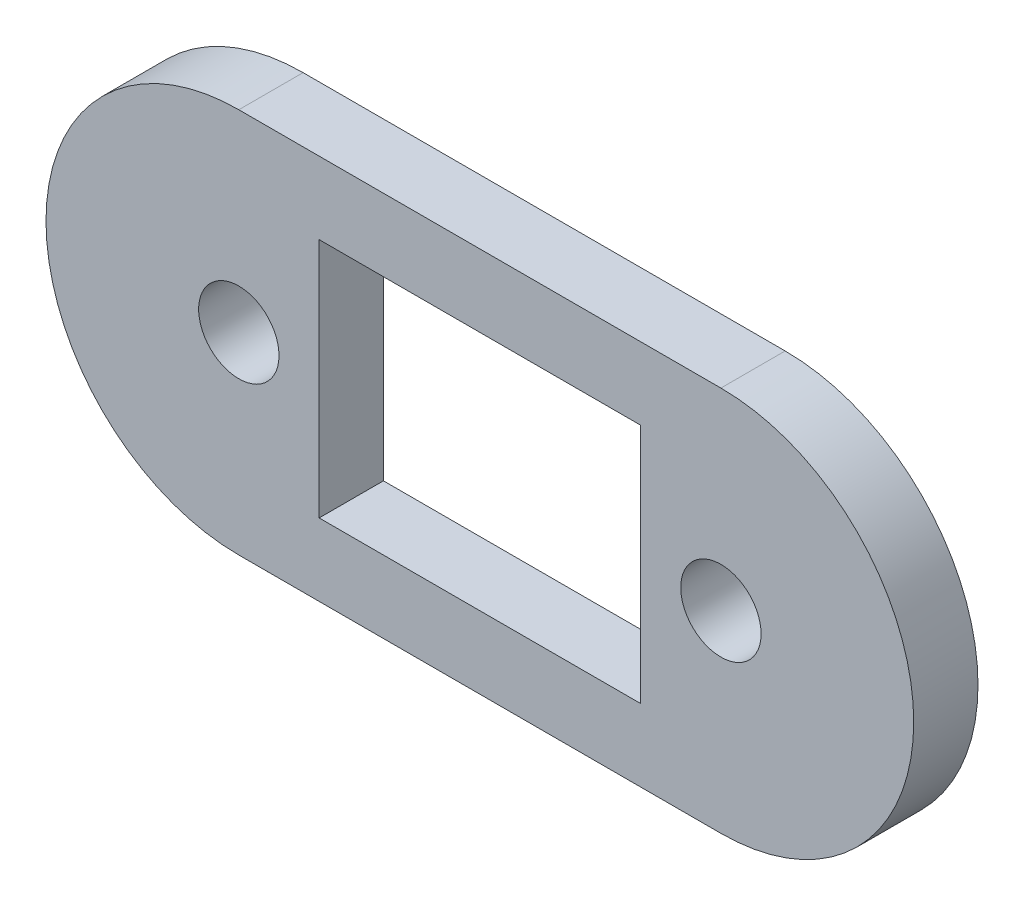
ISO-10303-21;
HEADER;
FILE_DESCRIPTION(('STEP AP214'),'2;1');
FILE_NAME('part.step','',(''),(''),'','','');
FILE_SCHEMA(('AUTOMOTIVE_DESIGN { 1 0 10303 214 1 1 1 1 }'));
ENDSEC;
DATA;
#1=APPLICATION_CONTEXT('core data for automotive mechanical design processes');
#2=APPLICATION_PROTOCOL_DEFINITION('international standard','automotive_design',2000,#1);
#3=PRODUCT_CONTEXT('',#1,'mechanical');
#4=PRODUCT('Part','Part','',(#3));
#5=PRODUCT_RELATED_PRODUCT_CATEGORY('part','',(#4));
#6=PRODUCT_DEFINITION_FORMATION('','',#4);
#7=PRODUCT_DEFINITION_CONTEXT('part definition',#1,'design');
#8=PRODUCT_DEFINITION('design','',#6,#7);
#9=PRODUCT_DEFINITION_SHAPE('','',#8);
#10=(LENGTH_UNIT() NAMED_UNIT(*) SI_UNIT(.MILLI.,.METRE.));
#11=(NAMED_UNIT(*) PLANE_ANGLE_UNIT() SI_UNIT($,.RADIAN.));
#12=(NAMED_UNIT(*) SI_UNIT($,.STERADIAN.) SOLID_ANGLE_UNIT());
#13=UNCERTAINTY_MEASURE_WITH_UNIT(LENGTH_MEASURE(1.E-05),#10,'distance_accuracy_value','');
#14=(GEOMETRIC_REPRESENTATION_CONTEXT(3) GLOBAL_UNCERTAINTY_ASSIGNED_CONTEXT((#13)) GLOBAL_UNIT_ASSIGNED_CONTEXT((#10,
#11,#12)) REPRESENTATION_CONTEXT('',''));
#15=CARTESIAN_POINT('',(0.,0.,0.));
#16=DIRECTION('',(0.,0.,1.));
#17=DIRECTION('',(1.,0.,0.));
#18=AXIS2_PLACEMENT_3D('',#15,#16,#17);
#19=CARTESIAN_POINT('',(-75.,0.,20.));
#20=DIRECTION('',(0.,0.,1.));
#21=DIRECTION('',(1.,0.,0.));
#22=AXIS2_PLACEMENT_3D('',#19,#20,#21);
#23=PLANE('',#22);
#24=CARTESIAN_POINT('',(75.,0.,20.));
#25=DIRECTION('',(0.,0.,1.));
#26=DIRECTION('',(1.,0.,0.));
#27=AXIS2_PLACEMENT_3D('',#24,#25,#26);
#28=CIRCLE('',#27,12.5);
#29=CARTESIAN_POINT('',(87.5,0.,20.));
#30=VERTEX_POINT('',#29);
#31=EDGE_CURVE('E126',#30,#30,#28,.T.);
#32=ORIENTED_EDGE('',*,*,#31,.F.);
#33=EDGE_LOOP('',(#32));
#34=FACE_BOUND('',#33,.T.);
#35=CARTESIAN_POINT('',(-75.,0.,20.));
#36=DIRECTION('',(0.,0.,1.));
#37=DIRECTION('',(1.,0.,0.));
#38=AXIS2_PLACEMENT_3D('',#35,#36,#37);
#39=CIRCLE('',#38,60.);
#40=CARTESIAN_POINT('',(-75.,60.,20.));
#41=VERTEX_POINT('',#40);
#42=CARTESIAN_POINT('',(-75.,-60.,20.));
#43=VERTEX_POINT('',#42);
#44=EDGE_CURVE('E136',#41,#43,#39,.T.);
#45=ORIENTED_EDGE('',*,*,#44,.T.);
#46=DIRECTION('',(1.,0.,0.));
#47=VECTOR('',#46,1.);
#48=CARTESIAN_POINT('',(-75.,-60.,20.));
#49=LINE('',#48,#47);
#50=CARTESIAN_POINT('',(75.,-60.,20.));
#51=VERTEX_POINT('',#50);
#52=EDGE_CURVE('E139',#43,#51,#49,.T.);
#53=ORIENTED_EDGE('',*,*,#52,.T.);
#54=CARTESIAN_POINT('',(75.,0.,20.));
#55=DIRECTION('',(0.,0.,1.));
#56=DIRECTION('',(1.,0.,0.));
#57=AXIS2_PLACEMENT_3D('',#54,#55,#56);
#58=CIRCLE('',#57,60.);
#59=CARTESIAN_POINT('',(75.,60.,20.));
#60=VERTEX_POINT('',#59);
#61=EDGE_CURVE('E142',#51,#60,#58,.T.);
#62=ORIENTED_EDGE('',*,*,#61,.T.);
#63=DIRECTION('',(-1.,0.,0.));
#64=VECTOR('',#63,1.);
#65=CARTESIAN_POINT('',(-75.,60.,20.));
#66=LINE('',#65,#64);
#67=EDGE_CURVE('E144',#60,#41,#66,.T.);
#68=ORIENTED_EDGE('',*,*,#67,.T.);
#69=EDGE_LOOP('',(#45,#53,#62,#68));
#70=FACE_BOUND('',#69,.T.);
#71=DIRECTION('',(1.,0.,0.));
#72=VECTOR('',#71,1.);
#73=CARTESIAN_POINT('',(50.,-37.5,20.));
#74=LINE('',#73,#72);
#75=CARTESIAN_POINT('',(-50.,-37.5,20.));
#76=VERTEX_POINT('',#75);
#77=CARTESIAN_POINT('',(50.,-37.5,20.));
#78=VERTEX_POINT('',#77);
#79=EDGE_CURVE('E105',#76,#78,#74,.T.);
#80=ORIENTED_EDGE('',*,*,#79,.F.);
#81=DIRECTION('',(0.,-1.,0.));
#82=VECTOR('',#81,1.);
#83=CARTESIAN_POINT('',(-50.,-37.5,20.));
#84=LINE('',#83,#82);
#85=CARTESIAN_POINT('',(-50.,37.5,20.));
#86=VERTEX_POINT('',#85);
#87=EDGE_CURVE('E97',#86,#76,#84,.T.);
#88=ORIENTED_EDGE('',*,*,#87,.F.);
#89=DIRECTION('',(-1.,0.,0.));
#90=VECTOR('',#89,1.);
#91=CARTESIAN_POINT('',(50.,37.5,20.));
#92=LINE('',#91,#90);
#93=CARTESIAN_POINT('',(50.,37.5,20.));
#94=VERTEX_POINT('',#93);
#95=EDGE_CURVE('E120',#94,#86,#92,.T.);
#96=ORIENTED_EDGE('',*,*,#95,.F.);
#97=DIRECTION('',(0.,1.,0.));
#98=VECTOR('',#97,1.);
#99=CARTESIAN_POINT('',(50.,-37.5,20.));
#100=LINE('',#99,#98);
#101=EDGE_CURVE('E118',#78,#94,#100,.T.);
#102=ORIENTED_EDGE('',*,*,#101,.F.);
#103=EDGE_LOOP('',(#80,#88,#96,#102));
#104=FACE_BOUND('',#103,.T.);
#105=CARTESIAN_POINT('',(-75.,0.,20.));
#106=DIRECTION('',(0.,0.,1.));
#107=DIRECTION('',(1.,0.,0.));
#108=AXIS2_PLACEMENT_3D('',#105,#106,#107);
#109=CIRCLE('',#108,12.5);
#110=CARTESIAN_POINT('',(-62.5,0.,20.));
#111=VERTEX_POINT('',#110);
#112=EDGE_CURVE('E226',#111,#111,#109,.T.);
#113=ORIENTED_EDGE('',*,*,#112,.F.);
#114=EDGE_LOOP('',(#113));
#115=FACE_BOUND('',#114,.T.);
#116=ADVANCED_FACE('F32',(#34,#70,#104,#115),#23,.T.);
#117=CARTESIAN_POINT('',(-75.,0.,0.));
#118=DIRECTION('',(0.,0.,1.));
#119=DIRECTION('',(1.,0.,0.));
#120=AXIS2_PLACEMENT_3D('',#117,#118,#119);
#121=PLANE('',#120);
#122=CARTESIAN_POINT('',(-75.,0.,0.));
#123=DIRECTION('',(0.,0.,1.));
#124=DIRECTION('',(1.,0.,0.));
#125=AXIS2_PLACEMENT_3D('',#122,#123,#124);
#126=CIRCLE('',#125,60.);
#127=CARTESIAN_POINT('',(-75.,60.,0.));
#128=VERTEX_POINT('',#127);
#129=CARTESIAN_POINT('',(-75.,-60.,0.));
#130=VERTEX_POINT('',#129);
#131=EDGE_CURVE('E113',#128,#130,#126,.T.);
#132=ORIENTED_EDGE('',*,*,#131,.F.);
#133=DIRECTION('',(-1.,0.,0.));
#134=VECTOR('',#133,1.);
#135=CARTESIAN_POINT('',(-75.,60.,0.));
#136=LINE('',#135,#134);
#137=CARTESIAN_POINT('',(75.,60.,0.));
#138=VERTEX_POINT('',#137);
#139=EDGE_CURVE('E140',#138,#128,#136,.T.);
#140=ORIENTED_EDGE('',*,*,#139,.F.);
#141=CARTESIAN_POINT('',(75.,0.,0.));
#142=DIRECTION('',(0.,0.,1.));
#143=DIRECTION('',(1.,0.,0.));
#144=AXIS2_PLACEMENT_3D('',#141,#142,#143);
#145=CIRCLE('',#144,60.);
#146=CARTESIAN_POINT('',(75.,-60.,0.));
#147=VERTEX_POINT('',#146);
#148=EDGE_CURVE('E151',#147,#138,#145,.T.);
#149=ORIENTED_EDGE('',*,*,#148,.F.);
#150=DIRECTION('',(1.,0.,0.));
#151=VECTOR('',#150,1.);
#152=CARTESIAN_POINT('',(-75.,-60.,0.));
#153=LINE('',#152,#151);
#154=EDGE_CURVE('E149',#130,#147,#153,.T.);
#155=ORIENTED_EDGE('',*,*,#154,.F.);
#156=EDGE_LOOP('',(#132,#140,#149,#155));
#157=FACE_BOUND('',#156,.T.);
#158=DIRECTION('',(0.,-1.,0.));
#159=VECTOR('',#158,1.);
#160=CARTESIAN_POINT('',(-50.,-37.5,0.));
#161=LINE('',#160,#159);
#162=CARTESIAN_POINT('',(-50.,37.5,0.));
#163=VERTEX_POINT('',#162);
#164=CARTESIAN_POINT('',(-50.,-37.5,0.));
#165=VERTEX_POINT('',#164);
#166=EDGE_CURVE('E55',#163,#165,#161,.T.);
#167=ORIENTED_EDGE('',*,*,#166,.T.);
#168=DIRECTION('',(1.,0.,0.));
#169=VECTOR('',#168,1.);
#170=CARTESIAN_POINT('',(50.,-37.5,0.));
#171=LINE('',#170,#169);
#172=CARTESIAN_POINT('',(50.,-37.5,0.));
#173=VERTEX_POINT('',#172);
#174=EDGE_CURVE('E112',#165,#173,#171,.T.);
#175=ORIENTED_EDGE('',*,*,#174,.T.);
#176=DIRECTION('',(0.,1.,0.));
#177=VECTOR('',#176,1.);
#178=CARTESIAN_POINT('',(50.,-37.5,0.));
#179=LINE('',#178,#177);
#180=CARTESIAN_POINT('',(50.,37.5,0.));
#181=VERTEX_POINT('',#180);
#182=EDGE_CURVE('E128',#173,#181,#179,.T.);
#183=ORIENTED_EDGE('',*,*,#182,.T.);
#184=DIRECTION('',(-1.,0.,0.));
#185=VECTOR('',#184,1.);
#186=CARTESIAN_POINT('',(50.,37.5,0.));
#187=LINE('',#186,#185);
#188=EDGE_CURVE('E106',#181,#163,#187,.T.);
#189=ORIENTED_EDGE('',*,*,#188,.T.);
#190=EDGE_LOOP('',(#167,#175,#183,#189));
#191=FACE_BOUND('',#190,.T.);
#192=CARTESIAN_POINT('',(75.,0.,0.));
#193=DIRECTION('',(0.,0.,1.));
#194=DIRECTION('',(1.,0.,0.));
#195=AXIS2_PLACEMENT_3D('',#192,#193,#194);
#196=CIRCLE('',#195,12.5);
#197=CARTESIAN_POINT('',(87.5,0.,0.));
#198=VERTEX_POINT('',#197);
#199=EDGE_CURVE('E232',#198,#198,#196,.T.);
#200=ORIENTED_EDGE('',*,*,#199,.T.);
#201=EDGE_LOOP('',(#200));
#202=FACE_BOUND('',#201,.T.);
#203=CARTESIAN_POINT('',(-75.,0.,0.));
#204=DIRECTION('',(0.,0.,1.));
#205=DIRECTION('',(1.,0.,0.));
#206=AXIS2_PLACEMENT_3D('',#203,#204,#205);
#207=CIRCLE('',#206,12.5);
#208=CARTESIAN_POINT('',(-62.5,0.,0.));
#209=VERTEX_POINT('',#208);
#210=EDGE_CURVE('E229',#209,#209,#207,.T.);
#211=ORIENTED_EDGE('',*,*,#210,.T.);
#212=EDGE_LOOP('',(#211));
#213=FACE_BOUND('',#212,.T.);
#214=ADVANCED_FACE('F169',(#157,#191,#202,#213),#121,.F.);
#215=CARTESIAN_POINT('',(-75.,0.,20.));
#216=DIRECTION('',(0.,0.,-1.));
#217=DIRECTION('',(-1.,0.,0.));
#218=AXIS2_PLACEMENT_3D('',#215,#216,#217);
#219=CYLINDRICAL_SURFACE('',#218,60.);
#220=ORIENTED_EDGE('',*,*,#131,.T.);
#221=DIRECTION('',(0.,0.,-1.));
#222=VECTOR('',#221,1.);
#223=CARTESIAN_POINT('',(-75.,-60.,20.));
#224=LINE('',#223,#222);
#225=EDGE_CURVE('E11',#43,#130,#224,.T.);
#226=ORIENTED_EDGE('',*,*,#225,.F.);
#227=ORIENTED_EDGE('',*,*,#44,.F.);
#228=DIRECTION('',(0.,0.,-1.));
#229=VECTOR('',#228,1.);
#230=CARTESIAN_POINT('',(-75.,60.,20.));
#231=LINE('',#230,#229);
#232=EDGE_CURVE('E146',#41,#128,#231,.T.);
#233=ORIENTED_EDGE('',*,*,#232,.T.);
#234=EDGE_LOOP('',(#220,#226,#227,#233));
#235=FACE_BOUND('',#234,.T.);
#236=ADVANCED_FACE('F34',(#235),#219,.T.);
#237=CARTESIAN_POINT('',(-75.,-60.,20.));
#238=DIRECTION('',(0.,1.,0.));
#239=DIRECTION('',(-1.,0.,0.));
#240=AXIS2_PLACEMENT_3D('',#237,#238,#239);
#241=PLANE('',#240);
#242=ORIENTED_EDGE('',*,*,#154,.T.);
#243=DIRECTION('',(0.,0.,-1.));
#244=VECTOR('',#243,1.);
#245=CARTESIAN_POINT('',(75.,-60.,20.));
#246=LINE('',#245,#244);
#247=EDGE_CURVE('E40',#51,#147,#246,.T.);
#248=ORIENTED_EDGE('',*,*,#247,.F.);
#249=ORIENTED_EDGE('',*,*,#52,.F.);
#250=ORIENTED_EDGE('',*,*,#225,.T.);
#251=EDGE_LOOP('',(#242,#248,#249,#250));
#252=FACE_BOUND('',#251,.T.);
#253=ADVANCED_FACE('F179',(#252),#241,.F.);
#254=CARTESIAN_POINT('',(75.,0.,20.));
#255=DIRECTION('',(0.,0.,-1.));
#256=DIRECTION('',(-1.,0.,0.));
#257=AXIS2_PLACEMENT_3D('',#254,#255,#256);
#258=CYLINDRICAL_SURFACE('',#257,60.);
#259=ORIENTED_EDGE('',*,*,#148,.T.);
#260=DIRECTION('',(0.,0.,-1.));
#261=VECTOR('',#260,1.);
#262=CARTESIAN_POINT('',(75.,60.,20.));
#263=LINE('',#262,#261);
#264=EDGE_CURVE('E156',#60,#138,#263,.T.);
#265=ORIENTED_EDGE('',*,*,#264,.F.);
#266=ORIENTED_EDGE('',*,*,#61,.F.);
#267=ORIENTED_EDGE('',*,*,#247,.T.);
#268=EDGE_LOOP('',(#259,#265,#266,#267));
#269=FACE_BOUND('',#268,.T.);
#270=ADVANCED_FACE('F163',(#269),#258,.T.);
#271=CARTESIAN_POINT('',(-75.,60.,20.));
#272=DIRECTION('',(0.,-1.,0.));
#273=DIRECTION('',(1.,0.,0.));
#274=AXIS2_PLACEMENT_3D('',#271,#272,#273);
#275=PLANE('',#274);
#276=ORIENTED_EDGE('',*,*,#139,.T.);
#277=ORIENTED_EDGE('',*,*,#232,.F.);
#278=ORIENTED_EDGE('',*,*,#67,.F.);
#279=ORIENTED_EDGE('',*,*,#264,.T.);
#280=EDGE_LOOP('',(#276,#277,#278,#279));
#281=FACE_BOUND('',#280,.T.);
#282=ADVANCED_FACE('F173',(#281),#275,.F.);
#283=CARTESIAN_POINT('',(-50.,-37.5,20.));
#284=DIRECTION('',(1.,0.,0.));
#285=DIRECTION('',(0.,1.,0.));
#286=AXIS2_PLACEMENT_3D('',#283,#284,#285);
#287=PLANE('',#286);
#288=ORIENTED_EDGE('',*,*,#166,.F.);
#289=DIRECTION('',(0.,0.,-1.));
#290=VECTOR('',#289,1.);
#291=CARTESIAN_POINT('',(-50.,37.5,20.));
#292=LINE('',#291,#290);
#293=EDGE_CURVE('E101',#86,#163,#292,.T.);
#294=ORIENTED_EDGE('',*,*,#293,.F.);
#295=ORIENTED_EDGE('',*,*,#87,.T.);
#296=DIRECTION('',(0.,0.,-1.));
#297=VECTOR('',#296,1.);
#298=CARTESIAN_POINT('',(-50.,-37.5,20.));
#299=LINE('',#298,#297);
#300=EDGE_CURVE('E100',#76,#165,#299,.T.);
#301=ORIENTED_EDGE('',*,*,#300,.T.);
#302=EDGE_LOOP('',(#288,#294,#295,#301));
#303=FACE_BOUND('',#302,.T.);
#304=ADVANCED_FACE('F99',(#303),#287,.T.);
#305=CARTESIAN_POINT('',(50.,-37.5,20.));
#306=DIRECTION('',(0.,1.,0.));
#307=DIRECTION('',(-1.,0.,0.));
#308=AXIS2_PLACEMENT_3D('',#305,#306,#307);
#309=PLANE('',#308);
#310=ORIENTED_EDGE('',*,*,#174,.F.);
#311=ORIENTED_EDGE('',*,*,#300,.F.);
#312=ORIENTED_EDGE('',*,*,#79,.T.);
#313=DIRECTION('',(0.,0.,-1.));
#314=VECTOR('',#313,1.);
#315=CARTESIAN_POINT('',(50.,-37.5,20.));
#316=LINE('',#315,#314);
#317=EDGE_CURVE('E114',#78,#173,#316,.T.);
#318=ORIENTED_EDGE('',*,*,#317,.T.);
#319=EDGE_LOOP('',(#310,#311,#312,#318));
#320=FACE_BOUND('',#319,.T.);
#321=ADVANCED_FACE('F109',(#320),#309,.T.);
#322=CARTESIAN_POINT('',(50.,-37.5,20.));
#323=DIRECTION('',(-1.,0.,0.));
#324=DIRECTION('',(0.,0.,1.));
#325=AXIS2_PLACEMENT_3D('',#322,#323,#324);
#326=PLANE('',#325);
#327=ORIENTED_EDGE('',*,*,#182,.F.);
#328=ORIENTED_EDGE('',*,*,#317,.F.);
#329=ORIENTED_EDGE('',*,*,#101,.T.);
#330=DIRECTION('',(0.,0.,-1.));
#331=VECTOR('',#330,1.);
#332=CARTESIAN_POINT('',(50.,37.5,20.));
#333=LINE('',#332,#331);
#334=EDGE_CURVE('E47',#94,#181,#333,.T.);
#335=ORIENTED_EDGE('',*,*,#334,.T.);
#336=EDGE_LOOP('',(#327,#328,#329,#335));
#337=FACE_BOUND('',#336,.T.);
#338=ADVANCED_FACE('F204',(#337),#326,.T.);
#339=CARTESIAN_POINT('',(50.,37.5,20.));
#340=DIRECTION('',(0.,-1.,0.));
#341=DIRECTION('',(1.,0.,0.));
#342=AXIS2_PLACEMENT_3D('',#339,#340,#341);
#343=PLANE('',#342);
#344=ORIENTED_EDGE('',*,*,#188,.F.);
#345=ORIENTED_EDGE('',*,*,#334,.F.);
#346=ORIENTED_EDGE('',*,*,#95,.T.);
#347=ORIENTED_EDGE('',*,*,#293,.T.);
#348=EDGE_LOOP('',(#344,#345,#346,#347));
#349=FACE_BOUND('',#348,.T.);
#350=ADVANCED_FACE('F208',(#349),#343,.T.);
#351=CARTESIAN_POINT('',(75.,0.,20.));
#352=DIRECTION('',(0.,0.,-1.));
#353=DIRECTION('',(-1.,0.,0.));
#354=AXIS2_PLACEMENT_3D('',#351,#352,#353);
#355=CYLINDRICAL_SURFACE('',#354,12.5);
#356=ORIENTED_EDGE('',*,*,#31,.T.);
#357=EDGE_LOOP('',(#356));
#358=FACE_BOUND('',#357,.T.);
#359=ORIENTED_EDGE('',*,*,#199,.F.);
#360=EDGE_LOOP('',(#359));
#361=FACE_BOUND('',#360,.T.);
#362=ADVANCED_FACE('F214',(#358,#361),#355,.F.);
#363=CARTESIAN_POINT('',(-75.,0.,20.));
#364=DIRECTION('',(0.,0.,-1.));
#365=DIRECTION('',(-1.,0.,0.));
#366=AXIS2_PLACEMENT_3D('',#363,#364,#365);
#367=CYLINDRICAL_SURFACE('',#366,12.5);
#368=ORIENTED_EDGE('',*,*,#112,.T.);
#369=EDGE_LOOP('',(#368));
#370=FACE_BOUND('',#369,.T.);
#371=ORIENTED_EDGE('',*,*,#210,.F.);
#372=EDGE_LOOP('',(#371));
#373=FACE_BOUND('',#372,.T.);
#374=ADVANCED_FACE('F217',(#370,#373),#367,.F.);
#375=CLOSED_SHELL('',(#116,#214,#236,#253,#270,#282,#304,#321,#338,#350,#362,#374));
#376=MANIFOLD_SOLID_BREP('B2',#375);
#377=ADVANCED_BREP_SHAPE_REPRESENTATION('',(#18,#376),#14);
#378=SHAPE_DEFINITION_REPRESENTATION(#9,#377);
ENDSEC;
END-ISO-10303-21;
